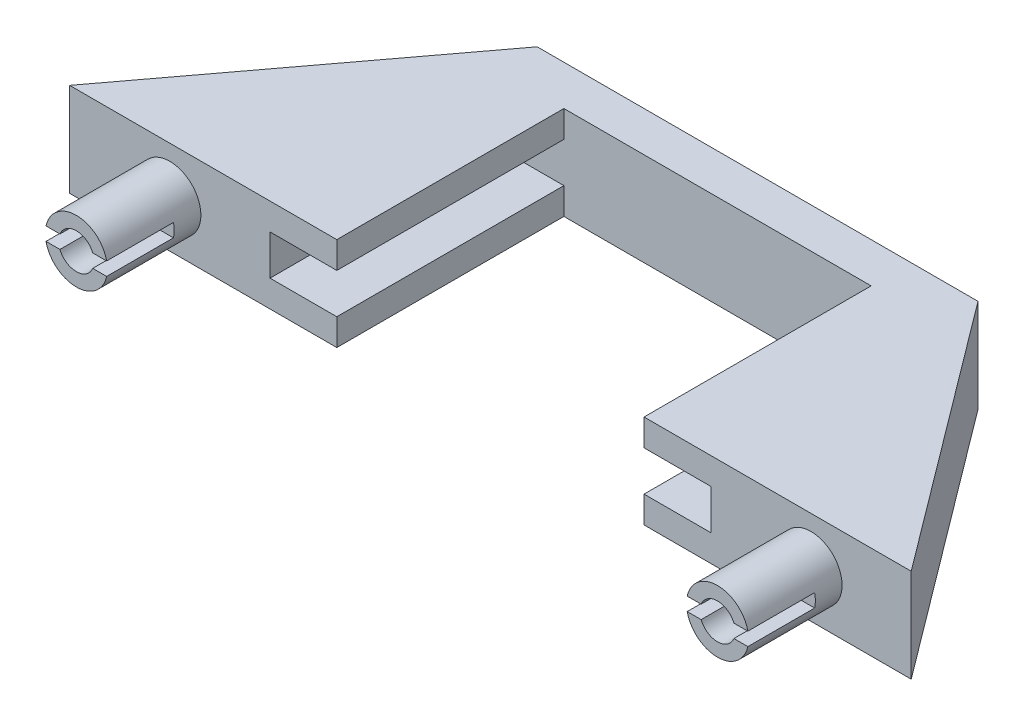
ISO-10303-21;
HEADER;
FILE_DESCRIPTION(('STEP AP214'),'2;1');
FILE_NAME('part.step','',(''),(''),'','','');
FILE_SCHEMA(('AUTOMOTIVE_DESIGN { 1 0 10303 214 1 1 1 1 }'));
ENDSEC;
DATA;
#1=APPLICATION_CONTEXT('core data for automotive mechanical design processes');
#2=APPLICATION_PROTOCOL_DEFINITION('international standard','automotive_design',2000,#1);
#3=PRODUCT_CONTEXT('',#1,'mechanical');
#4=PRODUCT('Part','Part','',(#3));
#5=PRODUCT_RELATED_PRODUCT_CATEGORY('part','',(#4));
#6=PRODUCT_DEFINITION_FORMATION('','',#4);
#7=PRODUCT_DEFINITION_CONTEXT('part definition',#1,'design');
#8=PRODUCT_DEFINITION('design','',#6,#7);
#9=PRODUCT_DEFINITION_SHAPE('','',#8);
#10=(LENGTH_UNIT() NAMED_UNIT(*) SI_UNIT(.MILLI.,.METRE.));
#11=(NAMED_UNIT(*) PLANE_ANGLE_UNIT() SI_UNIT($,.RADIAN.));
#12=(NAMED_UNIT(*) SI_UNIT($,.STERADIAN.) SOLID_ANGLE_UNIT());
#13=UNCERTAINTY_MEASURE_WITH_UNIT(LENGTH_MEASURE(1.E-05),#10,'distance_accuracy_value','');
#14=(GEOMETRIC_REPRESENTATION_CONTEXT(3) GLOBAL_UNCERTAINTY_ASSIGNED_CONTEXT((#13)) GLOBAL_UNIT_ASSIGNED_CONTEXT((#10,
#11,#12)) REPRESENTATION_CONTEXT('',''));
#15=CARTESIAN_POINT('',(0.,0.,0.));
#16=DIRECTION('',(0.,0.,1.));
#17=DIRECTION('',(1.,0.,0.));
#18=AXIS2_PLACEMENT_3D('',#15,#16,#17);
#19=CARTESIAN_POINT('',(24.,0.,27.));
#20=DIRECTION('',(0.,0.,1.));
#21=DIRECTION('',(1.,0.,0.));
#22=AXIS2_PLACEMENT_3D('',#19,#20,#21);
#23=PLANE('',#22);
#24=DIRECTION('',(-1.,0.,0.));
#25=VECTOR('',#24,1.);
#26=CARTESIAN_POINT('',(31.4065849831562,0.500000000000002,27.));
#27=LINE('',#26,#25);
#28=CARTESIAN_POINT('',(26.2706001409319,0.500000000000001,27.));
#29=VERTEX_POINT('',#28);
#30=CARTESIAN_POINT('',(25.2270391191808,0.500000000000001,27.));
#31=VERTEX_POINT('',#30);
#32=EDGE_CURVE('E458',#29,#31,#27,.T.);
#33=ORIENTED_EDGE('',*,*,#32,.F.);
#34=CARTESIAN_POINT('',(24.,0.,27.));
#35=DIRECTION('',(0.,0.,1.));
#36=DIRECTION('',(1.,0.,0.));
#37=AXIS2_PLACEMENT_3D('',#34,#35,#36);
#38=CIRCLE('',#37,2.325);
#39=CARTESIAN_POINT('',(21.7293998590681,0.500000000000001,27.));
#40=VERTEX_POINT('',#39);
#41=EDGE_CURVE('E271',#29,#40,#38,.T.);
#42=ORIENTED_EDGE('',*,*,#41,.T.);
#43=CARTESIAN_POINT('',(22.7729608808192,0.500000000000001,27.));
#44=VERTEX_POINT('',#43);
#45=EDGE_CURVE('E263',#44,#40,#27,.T.);
#46=ORIENTED_EDGE('',*,*,#45,.F.);
#47=CARTESIAN_POINT('',(24.,0.,27.));
#48=DIRECTION('',(0.,0.,1.));
#49=DIRECTION('',(1.,0.,0.));
#50=AXIS2_PLACEMENT_3D('',#47,#48,#49);
#51=CIRCLE('',#50,1.325);
#52=EDGE_CURVE('E494',#31,#44,#51,.T.);
#53=ORIENTED_EDGE('',*,*,#52,.F.);
#54=EDGE_LOOP('',(#33,#42,#46,#53));
#55=FACE_BOUND('',#54,.T.);
#56=ADVANCED_FACE('F33',(#55),#23,.T.);
#57=CARTESIAN_POINT('',(-24.,0.,27.));
#58=DIRECTION('',(0.,0.,1.));
#59=DIRECTION('',(1.,0.,0.));
#60=AXIS2_PLACEMENT_3D('',#57,#58,#59);
#61=PLANE('',#60);
#62=DIRECTION('',(1.,0.,0.));
#63=VECTOR('',#62,1.);
#64=CARTESIAN_POINT('',(-31.157432201403,-0.5,27.));
#65=LINE('',#64,#63);
#66=CARTESIAN_POINT('',(-26.2706001409319,-0.5,27.));
#67=VERTEX_POINT('',#66);
#68=CARTESIAN_POINT('',(-25.2270391191808,-0.5,27.));
#69=VERTEX_POINT('',#68);
#70=EDGE_CURVE('E443',#67,#69,#65,.T.);
#71=ORIENTED_EDGE('',*,*,#70,.F.);
#72=CARTESIAN_POINT('',(-24.,0.,27.));
#73=DIRECTION('',(0.,0.,1.));
#74=DIRECTION('',(1.,0.,0.));
#75=AXIS2_PLACEMENT_3D('',#72,#73,#74);
#76=CIRCLE('',#75,2.325);
#77=CARTESIAN_POINT('',(-21.7293998590681,-0.5,27.));
#78=VERTEX_POINT('',#77);
#79=EDGE_CURVE('E497',#67,#78,#76,.T.);
#80=ORIENTED_EDGE('',*,*,#79,.T.);
#81=CARTESIAN_POINT('',(-22.7729608808192,-0.5,27.));
#82=VERTEX_POINT('',#81);
#83=EDGE_CURVE('E446',#82,#78,#65,.T.);
#84=ORIENTED_EDGE('',*,*,#83,.F.);
#85=CARTESIAN_POINT('',(-24.,0.,27.));
#86=DIRECTION('',(0.,0.,1.));
#87=DIRECTION('',(1.,0.,0.));
#88=AXIS2_PLACEMENT_3D('',#85,#86,#87);
#89=CIRCLE('',#88,1.325);
#90=EDGE_CURVE('E490',#69,#82,#89,.T.);
#91=ORIENTED_EDGE('',*,*,#90,.F.);
#92=EDGE_LOOP('',(#71,#80,#84,#91));
#93=FACE_BOUND('',#92,.T.);
#94=ADVANCED_FACE('F593',(#93),#61,.T.);
#95=CARTESIAN_POINT('',(0.,0.,3.));
#96=DIRECTION('',(0.,0.,1.));
#97=DIRECTION('',(1.,0.,0.));
#98=AXIS2_PLACEMENT_3D('',#95,#96,#97);
#99=PLANE('',#98);
#100=DIRECTION('',(1.,0.,0.));
#101=VECTOR('',#100,1.);
#102=CARTESIAN_POINT('',(16.5,1.5,3.));
#103=LINE('',#102,#101);
#104=CARTESIAN_POINT('',(11.5,1.5,3.));
#105=VERTEX_POINT('',#104);
#106=CARTESIAN_POINT('',(16.5,1.5,3.));
#107=VERTEX_POINT('',#106);
#108=EDGE_CURVE('E308',#105,#107,#103,.T.);
#109=ORIENTED_EDGE('',*,*,#108,.F.);
#110=DIRECTION('',(0.,-1.,0.));
#111=VECTOR('',#110,1.);
#112=CARTESIAN_POINT('',(11.5,3.5,3.));
#113=LINE('',#112,#111);
#114=CARTESIAN_POINT('',(11.5,3.5,3.));
#115=VERTEX_POINT('',#114);
#116=EDGE_CURVE('E302',#115,#105,#113,.T.);
#117=ORIENTED_EDGE('',*,*,#116,.F.);
#118=DIRECTION('',(-1.,0.,0.));
#119=VECTOR('',#118,1.);
#120=CARTESIAN_POINT('',(-16.5,3.5,3.));
#121=LINE('',#120,#119);
#122=CARTESIAN_POINT('',(-11.5,3.5,3.));
#123=VERTEX_POINT('',#122);
#124=EDGE_CURVE('E390',#115,#123,#121,.T.);
#125=ORIENTED_EDGE('',*,*,#124,.T.);
#126=DIRECTION('',(0.,1.,0.));
#127=VECTOR('',#126,1.);
#128=CARTESIAN_POINT('',(-11.5,3.5,3.));
#129=LINE('',#128,#127);
#130=CARTESIAN_POINT('',(-11.5,1.5,3.));
#131=VERTEX_POINT('',#130);
#132=EDGE_CURVE('E369',#131,#123,#129,.T.);
#133=ORIENTED_EDGE('',*,*,#132,.F.);
#134=DIRECTION('',(1.,0.,0.));
#135=VECTOR('',#134,1.);
#136=CARTESIAN_POINT('',(-16.5,1.5,3.));
#137=LINE('',#136,#135);
#138=CARTESIAN_POINT('',(-16.5,1.5,3.));
#139=VERTEX_POINT('',#138);
#140=EDGE_CURVE('E365',#139,#131,#137,.T.);
#141=ORIENTED_EDGE('',*,*,#140,.F.);
#142=DIRECTION('',(0.,-1.,0.));
#143=VECTOR('',#142,1.);
#144=CARTESIAN_POINT('',(-16.5,3.5,3.));
#145=LINE('',#144,#143);
#146=CARTESIAN_POINT('',(-16.5,-1.5,3.));
#147=VERTEX_POINT('',#146);
#148=EDGE_CURVE('E393',#139,#147,#145,.T.);
#149=ORIENTED_EDGE('',*,*,#148,.T.);
#150=DIRECTION('',(-1.,0.,0.));
#151=VECTOR('',#150,1.);
#152=CARTESIAN_POINT('',(-16.5,-1.5,3.));
#153=LINE('',#152,#151);
#154=CARTESIAN_POINT('',(-11.5,-1.5,3.));
#155=VERTEX_POINT('',#154);
#156=EDGE_CURVE('E350',#155,#147,#153,.T.);
#157=ORIENTED_EDGE('',*,*,#156,.F.);
#158=DIRECTION('',(0.,1.,0.));
#159=VECTOR('',#158,1.);
#160=CARTESIAN_POINT('',(-11.5,-3.5,3.));
#161=LINE('',#160,#159);
#162=CARTESIAN_POINT('',(-11.5,-3.5,3.));
#163=VERTEX_POINT('',#162);
#164=EDGE_CURVE('E346',#163,#155,#161,.T.);
#165=ORIENTED_EDGE('',*,*,#164,.F.);
#166=DIRECTION('',(1.,0.,0.));
#167=VECTOR('',#166,1.);
#168=CARTESIAN_POINT('',(-16.5,-3.5,3.));
#169=LINE('',#168,#167);
#170=CARTESIAN_POINT('',(11.5,-3.5,3.));
#171=VERTEX_POINT('',#170);
#172=EDGE_CURVE('E396',#163,#171,#169,.T.);
#173=ORIENTED_EDGE('',*,*,#172,.T.);
#174=DIRECTION('',(0.,-1.,0.));
#175=VECTOR('',#174,1.);
#176=CARTESIAN_POINT('',(11.5,-3.5,3.));
#177=LINE('',#176,#175);
#178=CARTESIAN_POINT('',(11.5,-1.5,3.));
#179=VERTEX_POINT('',#178);
#180=EDGE_CURVE('E329',#179,#171,#177,.T.);
#181=ORIENTED_EDGE('',*,*,#180,.F.);
#182=DIRECTION('',(-1.,0.,0.));
#183=VECTOR('',#182,1.);
#184=CARTESIAN_POINT('',(16.5,-1.5,3.));
#185=LINE('',#184,#183);
#186=CARTESIAN_POINT('',(16.5,-1.5,3.));
#187=VERTEX_POINT('',#186);
#188=EDGE_CURVE('E325',#187,#179,#185,.T.);
#189=ORIENTED_EDGE('',*,*,#188,.F.);
#190=DIRECTION('',(0.,1.,0.));
#191=VECTOR('',#190,1.);
#192=CARTESIAN_POINT('',(16.5,3.5,3.));
#193=LINE('',#192,#191);
#194=EDGE_CURVE('E387',#187,#107,#193,.T.);
#195=ORIENTED_EDGE('',*,*,#194,.T.);
#196=EDGE_LOOP('',(#109,#117,#125,#133,#141,#149,#157,#165,#173,#181,#189,#195));
#197=FACE_BOUND('',#196,.T.);
#198=ADVANCED_FACE('F558',(#197),#99,.T.);
#199=CARTESIAN_POINT('',(-16.5,3.5,3.));
#200=DIRECTION('',(0.,-1.,0.));
#201=DIRECTION('',(0.,0.,-1.));
#202=AXIS2_PLACEMENT_3D('',#199,#200,#201);
#203=PLANE('',#202);
#204=DIRECTION('',(-1.,0.,0.));
#205=VECTOR('',#204,1.);
#206=CARTESIAN_POINT('',(-16.5,3.5,0.));
#207=LINE('',#206,#205);
#208=CARTESIAN_POINT('',(16.5,3.5,0.));
#209=VERTEX_POINT('',#208);
#210=CARTESIAN_POINT('',(-16.5,3.5,0.));
#211=VERTEX_POINT('',#210);
#212=EDGE_CURVE('E400',#209,#211,#207,.T.);
#213=ORIENTED_EDGE('',*,*,#212,.T.);
#214=DIRECTION('',(-0.6,0.,0.8));
#215=VECTOR('',#214,1.);
#216=CARTESIAN_POINT('',(-31.5,3.5,20.));
#217=LINE('',#216,#215);
#218=CARTESIAN_POINT('',(-31.5,3.5,20.));
#219=VERTEX_POINT('',#218);
#220=EDGE_CURVE('E291',#211,#219,#217,.T.);
#221=ORIENTED_EDGE('',*,*,#220,.T.);
#222=DIRECTION('',(-1.,0.,0.));
#223=VECTOR('',#222,1.);
#224=CARTESIAN_POINT('',(-16.5,3.5,20.));
#225=LINE('',#224,#223);
#226=CARTESIAN_POINT('',(-11.5,3.5,20.));
#227=VERTEX_POINT('',#226);
#228=EDGE_CURVE('E371',#227,#219,#225,.T.);
#229=ORIENTED_EDGE('',*,*,#228,.F.);
#230=DIRECTION('',(0.,0.,-1.));
#231=VECTOR('',#230,1.);
#232=CARTESIAN_POINT('',(-11.5,3.5,20.));
#233=LINE('',#232,#231);
#234=EDGE_CURVE('E373',#227,#123,#233,.T.);
#235=ORIENTED_EDGE('',*,*,#234,.T.);
#236=ORIENTED_EDGE('',*,*,#124,.F.);
#237=DIRECTION('',(0.,0.,-1.));
#238=VECTOR('',#237,1.);
#239=CARTESIAN_POINT('',(11.5,3.5,20.));
#240=LINE('',#239,#238);
#241=CARTESIAN_POINT('',(11.5,3.5,20.));
#242=VERTEX_POINT('',#241);
#243=EDGE_CURVE('E322',#242,#115,#240,.T.);
#244=ORIENTED_EDGE('',*,*,#243,.F.);
#245=DIRECTION('',(-1.,0.,0.));
#246=VECTOR('',#245,1.);
#247=CARTESIAN_POINT('',(16.5,3.5,20.));
#248=LINE('',#247,#246);
#249=CARTESIAN_POINT('',(31.5,3.5,20.));
#250=VERTEX_POINT('',#249);
#251=EDGE_CURVE('E305',#250,#242,#248,.T.);
#252=ORIENTED_EDGE('',*,*,#251,.F.);
#253=DIRECTION('',(-0.6,0.,-0.8));
#254=VECTOR('',#253,1.);
#255=CARTESIAN_POINT('',(31.5,3.5,20.));
#256=LINE('',#255,#254);
#257=EDGE_CURVE('E275',#250,#209,#256,.T.);
#258=ORIENTED_EDGE('',*,*,#257,.T.);
#259=EDGE_LOOP('',(#213,#221,#229,#235,#236,#244,#252,#258));
#260=FACE_BOUND('',#259,.T.);
#261=ADVANCED_FACE('F35',(#260),#203,.F.);
#262=CARTESIAN_POINT('',(-16.5,-3.5,3.));
#263=DIRECTION('',(0.,1.,0.));
#264=DIRECTION('',(0.,0.,1.));
#265=AXIS2_PLACEMENT_3D('',#262,#263,#264);
#266=PLANE('',#265);
#267=DIRECTION('',(1.,0.,0.));
#268=VECTOR('',#267,1.);
#269=CARTESIAN_POINT('',(-16.5,-3.5,0.));
#270=LINE('',#269,#268);
#271=CARTESIAN_POINT('',(-16.5,-3.5,0.));
#272=VERTEX_POINT('',#271);
#273=CARTESIAN_POINT('',(16.5,-3.5,0.));
#274=VERTEX_POINT('',#273);
#275=EDGE_CURVE('E391',#272,#274,#270,.T.);
#276=ORIENTED_EDGE('',*,*,#275,.T.);
#277=DIRECTION('',(-0.6,0.,-0.8));
#278=VECTOR('',#277,1.);
#279=CARTESIAN_POINT('',(31.5,-3.5,20.));
#280=LINE('',#279,#278);
#281=CARTESIAN_POINT('',(31.5,-3.5,20.));
#282=VERTEX_POINT('',#281);
#283=EDGE_CURVE('E283',#282,#274,#280,.T.);
#284=ORIENTED_EDGE('',*,*,#283,.F.);
#285=DIRECTION('',(1.,0.,0.));
#286=VECTOR('',#285,1.);
#287=CARTESIAN_POINT('',(16.5,-3.5,20.));
#288=LINE('',#287,#286);
#289=CARTESIAN_POINT('',(11.5,-3.5,20.));
#290=VERTEX_POINT('',#289);
#291=EDGE_CURVE('E331',#290,#282,#288,.T.);
#292=ORIENTED_EDGE('',*,*,#291,.F.);
#293=DIRECTION('',(0.,0.,-1.));
#294=VECTOR('',#293,1.);
#295=CARTESIAN_POINT('',(11.5,-3.5,20.));
#296=LINE('',#295,#294);
#297=EDGE_CURVE('E333',#290,#171,#296,.T.);
#298=ORIENTED_EDGE('',*,*,#297,.T.);
#299=ORIENTED_EDGE('',*,*,#172,.F.);
#300=DIRECTION('',(0.,0.,-1.));
#301=VECTOR('',#300,1.);
#302=CARTESIAN_POINT('',(-11.5,-3.5,20.));
#303=LINE('',#302,#301);
#304=CARTESIAN_POINT('',(-11.5,-3.5,20.));
#305=VERTEX_POINT('',#304);
#306=EDGE_CURVE('E363',#305,#163,#303,.T.);
#307=ORIENTED_EDGE('',*,*,#306,.F.);
#308=DIRECTION('',(1.,0.,0.));
#309=VECTOR('',#308,1.);
#310=CARTESIAN_POINT('',(-16.5,-3.5,20.));
#311=LINE('',#310,#309);
#312=CARTESIAN_POINT('',(-31.5,-3.5,20.));
#313=VERTEX_POINT('',#312);
#314=EDGE_CURVE('E347',#313,#305,#311,.T.);
#315=ORIENTED_EDGE('',*,*,#314,.F.);
#316=DIRECTION('',(-0.6,0.,0.8));
#317=VECTOR('',#316,1.);
#318=CARTESIAN_POINT('',(-31.5,-3.5,20.));
#319=LINE('',#318,#317);
#320=EDGE_CURVE('E293',#272,#313,#319,.T.);
#321=ORIENTED_EDGE('',*,*,#320,.F.);
#322=EDGE_LOOP('',(#276,#284,#292,#298,#299,#307,#315,#321));
#323=FACE_BOUND('',#322,.T.);
#324=ADVANCED_FACE('F533',(#323),#266,.F.);
#325=CARTESIAN_POINT('',(0.,0.,0.));
#326=DIRECTION('',(0.,0.,1.));
#327=DIRECTION('',(1.,0.,0.));
#328=AXIS2_PLACEMENT_3D('',#325,#326,#327);
#329=PLANE('',#328);
#330=DIRECTION('',(0.,1.,0.));
#331=VECTOR('',#330,1.);
#332=CARTESIAN_POINT('',(16.5,3.5,0.));
#333=LINE('',#332,#331);
#334=EDGE_CURVE('E386',#274,#209,#333,.T.);
#335=ORIENTED_EDGE('',*,*,#334,.F.);
#336=ORIENTED_EDGE('',*,*,#275,.F.);
#337=DIRECTION('',(0.,-1.,0.));
#338=VECTOR('',#337,1.);
#339=CARTESIAN_POINT('',(-16.5,3.5,0.));
#340=LINE('',#339,#338);
#341=EDGE_CURVE('E403',#211,#272,#340,.T.);
#342=ORIENTED_EDGE('',*,*,#341,.F.);
#343=ORIENTED_EDGE('',*,*,#212,.F.);
#344=EDGE_LOOP('',(#335,#336,#342,#343));
#345=FACE_BOUND('',#344,.T.);
#346=ADVANCED_FACE('F531',(#345),#329,.F.);
#347=CARTESIAN_POINT('',(-16.5,1.5,20.));
#348=DIRECTION('',(0.,1.,0.));
#349=DIRECTION('',(0.,0.,1.));
#350=AXIS2_PLACEMENT_3D('',#347,#348,#349);
#351=PLANE('',#350);
#352=ORIENTED_EDGE('',*,*,#140,.T.);
#353=DIRECTION('',(0.,0.,-1.));
#354=VECTOR('',#353,1.);
#355=CARTESIAN_POINT('',(-11.5,1.5,20.));
#356=LINE('',#355,#354);
#357=CARTESIAN_POINT('',(-11.5,1.5,20.));
#358=VERTEX_POINT('',#357);
#359=EDGE_CURVE('E380',#358,#131,#356,.T.);
#360=ORIENTED_EDGE('',*,*,#359,.F.);
#361=DIRECTION('',(1.,0.,0.));
#362=VECTOR('',#361,1.);
#363=CARTESIAN_POINT('',(-16.5,1.5,20.));
#364=LINE('',#363,#362);
#365=CARTESIAN_POINT('',(-16.5,1.5,20.));
#366=VERTEX_POINT('',#365);
#367=EDGE_CURVE('E366',#366,#358,#364,.T.);
#368=ORIENTED_EDGE('',*,*,#367,.F.);
#369=DIRECTION('',(0.,0.,-1.));
#370=VECTOR('',#369,1.);
#371=CARTESIAN_POINT('',(-16.5,1.5,20.));
#372=LINE('',#371,#370);
#373=EDGE_CURVE('E383',#366,#139,#372,.T.);
#374=ORIENTED_EDGE('',*,*,#373,.T.);
#375=EDGE_LOOP('',(#352,#360,#368,#374));
#376=FACE_BOUND('',#375,.T.);
#377=ADVANCED_FACE('F552',(#376),#351,.F.);
#378=CARTESIAN_POINT('',(-11.5,3.5,20.));
#379=DIRECTION('',(-1.,0.,0.));
#380=DIRECTION('',(0.,0.,1.));
#381=AXIS2_PLACEMENT_3D('',#378,#379,#380);
#382=PLANE('',#381);
#383=ORIENTED_EDGE('',*,*,#132,.T.);
#384=ORIENTED_EDGE('',*,*,#234,.F.);
#385=DIRECTION('',(0.,1.,0.));
#386=VECTOR('',#385,1.);
#387=CARTESIAN_POINT('',(-11.5,3.5,20.));
#388=LINE('',#387,#386);
#389=EDGE_CURVE('E368',#358,#227,#388,.T.);
#390=ORIENTED_EDGE('',*,*,#389,.F.);
#391=ORIENTED_EDGE('',*,*,#359,.T.);
#392=EDGE_LOOP('',(#383,#384,#390,#391));
#393=FACE_BOUND('',#392,.T.);
#394=ADVANCED_FACE('F515',(#393),#382,.F.);
#395=CARTESIAN_POINT('',(0.,0.,20.));
#396=DIRECTION('',(0.,0.,1.));
#397=DIRECTION('',(1.,0.,0.));
#398=AXIS2_PLACEMENT_3D('',#395,#396,#397);
#399=PLANE('',#398);
#400=CARTESIAN_POINT('',(-24.,0.,20.));
#401=DIRECTION('',(0.,0.,1.));
#402=DIRECTION('',(1.,0.,0.));
#403=AXIS2_PLACEMENT_3D('',#400,#401,#402);
#404=CIRCLE('',#403,2.325);
#405=CARTESIAN_POINT('',(-21.675,0.,20.));
#406=VERTEX_POINT('',#405);
#407=EDGE_CURVE('E280',#406,#406,#404,.T.);
#408=ORIENTED_EDGE('',*,*,#407,.F.);
#409=EDGE_LOOP('',(#408));
#410=FACE_BOUND('',#409,.T.);
#411=ORIENTED_EDGE('',*,*,#228,.T.);
#412=DIRECTION('',(0.,1.,0.));
#413=VECTOR('',#412,1.);
#414=CARTESIAN_POINT('',(-31.5,-3.5,20.));
#415=LINE('',#414,#413);
#416=EDGE_CURVE('E296',#313,#219,#415,.T.);
#417=ORIENTED_EDGE('',*,*,#416,.F.);
#418=ORIENTED_EDGE('',*,*,#314,.T.);
#419=DIRECTION('',(0.,1.,0.));
#420=VECTOR('',#419,1.);
#421=CARTESIAN_POINT('',(-11.5,-3.5,20.));
#422=LINE('',#421,#420);
#423=CARTESIAN_POINT('',(-11.5,-1.5,20.));
#424=VERTEX_POINT('',#423);
#425=EDGE_CURVE('E349',#305,#424,#422,.T.);
#426=ORIENTED_EDGE('',*,*,#425,.T.);
#427=DIRECTION('',(-1.,0.,0.));
#428=VECTOR('',#427,1.);
#429=CARTESIAN_POINT('',(-16.5,-1.5,20.));
#430=LINE('',#429,#428);
#431=CARTESIAN_POINT('',(-16.5,-1.5,20.));
#432=VERTEX_POINT('',#431);
#433=EDGE_CURVE('E352',#424,#432,#430,.T.);
#434=ORIENTED_EDGE('',*,*,#433,.T.);
#435=DIRECTION('',(0.,1.,0.));
#436=VECTOR('',#435,1.);
#437=CARTESIAN_POINT('',(-16.5,-3.5,20.));
#438=LINE('',#437,#436);
#439=EDGE_CURVE('E299',#432,#366,#438,.T.);
#440=ORIENTED_EDGE('',*,*,#439,.T.);
#441=ORIENTED_EDGE('',*,*,#367,.T.);
#442=ORIENTED_EDGE('',*,*,#389,.T.);
#443=EDGE_LOOP('',(#411,#417,#418,#426,#434,#440,#441,#442));
#444=FACE_BOUND('',#443,.T.);
#445=ADVANCED_FACE('F511',(#410,#444),#399,.T.);
#446=CARTESIAN_POINT('',(-11.5,-3.5,20.));
#447=DIRECTION('',(-1.,0.,0.));
#448=DIRECTION('',(0.,0.,1.));
#449=AXIS2_PLACEMENT_3D('',#446,#447,#448);
#450=PLANE('',#449);
#451=ORIENTED_EDGE('',*,*,#164,.T.);
#452=DIRECTION('',(0.,0.,-1.));
#453=VECTOR('',#452,1.);
#454=CARTESIAN_POINT('',(-11.5,-1.5,20.));
#455=LINE('',#454,#453);
#456=EDGE_CURVE('E361',#424,#155,#455,.T.);
#457=ORIENTED_EDGE('',*,*,#456,.F.);
#458=ORIENTED_EDGE('',*,*,#425,.F.);
#459=ORIENTED_EDGE('',*,*,#306,.T.);
#460=EDGE_LOOP('',(#451,#457,#458,#459));
#461=FACE_BOUND('',#460,.T.);
#462=ADVANCED_FACE('F514',(#461),#450,.F.);
#463=CARTESIAN_POINT('',(-16.5,-1.5,20.));
#464=DIRECTION('',(0.,-1.,0.));
#465=DIRECTION('',(0.,0.,-1.));
#466=AXIS2_PLACEMENT_3D('',#463,#464,#465);
#467=PLANE('',#466);
#468=ORIENTED_EDGE('',*,*,#156,.T.);
#469=DIRECTION('',(0.,0.,-1.));
#470=VECTOR('',#469,1.);
#471=CARTESIAN_POINT('',(-16.5,-1.5,20.));
#472=LINE('',#471,#470);
#473=EDGE_CURVE('E355',#432,#147,#472,.T.);
#474=ORIENTED_EDGE('',*,*,#473,.F.);
#475=ORIENTED_EDGE('',*,*,#433,.F.);
#476=ORIENTED_EDGE('',*,*,#456,.T.);
#477=EDGE_LOOP('',(#468,#474,#475,#476));
#478=FACE_BOUND('',#477,.T.);
#479=ADVANCED_FACE('F545',(#478),#467,.F.);
#480=CARTESIAN_POINT('',(16.5,-1.5,20.));
#481=DIRECTION('',(0.,-1.,0.));
#482=DIRECTION('',(1.,0.,0.));
#483=AXIS2_PLACEMENT_3D('',#480,#481,#482);
#484=PLANE('',#483);
#485=ORIENTED_EDGE('',*,*,#188,.T.);
#486=DIRECTION('',(0.,0.,-1.));
#487=VECTOR('',#486,1.);
#488=CARTESIAN_POINT('',(11.5,-1.5,20.));
#489=LINE('',#488,#487);
#490=CARTESIAN_POINT('',(11.5,-1.5,20.));
#491=VERTEX_POINT('',#490);
#492=EDGE_CURVE('E340',#491,#179,#489,.T.);
#493=ORIENTED_EDGE('',*,*,#492,.F.);
#494=DIRECTION('',(-1.,0.,0.));
#495=VECTOR('',#494,1.);
#496=CARTESIAN_POINT('',(16.5,-1.5,20.));
#497=LINE('',#496,#495);
#498=CARTESIAN_POINT('',(16.5,-1.5,20.));
#499=VERTEX_POINT('',#498);
#500=EDGE_CURVE('E326',#499,#491,#497,.T.);
#501=ORIENTED_EDGE('',*,*,#500,.F.);
#502=DIRECTION('',(0.,0.,-1.));
#503=VECTOR('',#502,1.);
#504=CARTESIAN_POINT('',(16.5,-1.5,20.));
#505=LINE('',#504,#503);
#506=EDGE_CURVE('E343',#499,#187,#505,.T.);
#507=ORIENTED_EDGE('',*,*,#506,.T.);
#508=EDGE_LOOP('',(#485,#493,#501,#507));
#509=FACE_BOUND('',#508,.T.);
#510=ADVANCED_FACE('F578',(#509),#484,.F.);
#511=CARTESIAN_POINT('',(11.5,-3.5,20.));
#512=DIRECTION('',(1.,0.,0.));
#513=DIRECTION('',(0.,0.,-1.));
#514=AXIS2_PLACEMENT_3D('',#511,#512,#513);
#515=PLANE('',#514);
#516=ORIENTED_EDGE('',*,*,#180,.T.);
#517=ORIENTED_EDGE('',*,*,#297,.F.);
#518=DIRECTION('',(0.,-1.,0.));
#519=VECTOR('',#518,1.);
#520=CARTESIAN_POINT('',(11.5,-3.5,20.));
#521=LINE('',#520,#519);
#522=EDGE_CURVE('E328',#491,#290,#521,.T.);
#523=ORIENTED_EDGE('',*,*,#522,.F.);
#524=ORIENTED_EDGE('',*,*,#492,.T.);
#525=EDGE_LOOP('',(#516,#517,#523,#524));
#526=FACE_BOUND('',#525,.T.);
#527=ADVANCED_FACE('F574',(#526),#515,.F.);
#528=CARTESIAN_POINT('',(0.,0.,20.));
#529=DIRECTION('',(0.,0.,1.));
#530=DIRECTION('',(1.,0.,0.));
#531=AXIS2_PLACEMENT_3D('',#528,#529,#530);
#532=PLANE('',#531);
#533=CARTESIAN_POINT('',(24.,0.,20.));
#534=DIRECTION('',(0.,0.,1.));
#535=DIRECTION('',(1.,0.,0.));
#536=AXIS2_PLACEMENT_3D('',#533,#534,#535);
#537=CIRCLE('',#536,2.325);
#538=CARTESIAN_POINT('',(26.325,0.,20.));
#539=VERTEX_POINT('',#538);
#540=EDGE_CURVE('E272',#539,#539,#537,.T.);
#541=ORIENTED_EDGE('',*,*,#540,.F.);
#542=EDGE_LOOP('',(#541));
#543=FACE_BOUND('',#542,.T.);
#544=ORIENTED_EDGE('',*,*,#291,.T.);
#545=DIRECTION('',(0.,1.,0.));
#546=VECTOR('',#545,1.);
#547=CARTESIAN_POINT('',(31.5,-3.5,20.));
#548=LINE('',#547,#546);
#549=EDGE_CURVE('E288',#282,#250,#548,.T.);
#550=ORIENTED_EDGE('',*,*,#549,.T.);
#551=ORIENTED_EDGE('',*,*,#251,.T.);
#552=DIRECTION('',(0.,-1.,0.));
#553=VECTOR('',#552,1.);
#554=CARTESIAN_POINT('',(11.5,3.5,20.));
#555=LINE('',#554,#553);
#556=CARTESIAN_POINT('',(11.5,1.5,20.));
#557=VERTEX_POINT('',#556);
#558=EDGE_CURVE('E307',#242,#557,#555,.T.);
#559=ORIENTED_EDGE('',*,*,#558,.T.);
#560=DIRECTION('',(1.,0.,0.));
#561=VECTOR('',#560,1.);
#562=CARTESIAN_POINT('',(16.5,1.5,20.));
#563=LINE('',#562,#561);
#564=CARTESIAN_POINT('',(16.5,1.5,20.));
#565=VERTEX_POINT('',#564);
#566=EDGE_CURVE('E310',#557,#565,#563,.T.);
#567=ORIENTED_EDGE('',*,*,#566,.T.);
#568=DIRECTION('',(0.,1.,0.));
#569=VECTOR('',#568,1.);
#570=CARTESIAN_POINT('',(16.5,-3.5,20.));
#571=LINE('',#570,#569);
#572=EDGE_CURVE('E285',#499,#565,#571,.T.);
#573=ORIENTED_EDGE('',*,*,#572,.F.);
#574=ORIENTED_EDGE('',*,*,#500,.T.);
#575=ORIENTED_EDGE('',*,*,#522,.T.);
#576=EDGE_LOOP('',(#544,#550,#551,#559,#567,#573,#574,#575));
#577=FACE_BOUND('',#576,.T.);
#578=ADVANCED_FACE('F564',(#543,#577),#532,.T.);
#579=CARTESIAN_POINT('',(11.5,3.5,20.));
#580=DIRECTION('',(1.,0.,0.));
#581=DIRECTION('',(0.,0.,-1.));
#582=AXIS2_PLACEMENT_3D('',#579,#580,#581);
#583=PLANE('',#582);
#584=ORIENTED_EDGE('',*,*,#116,.T.);
#585=DIRECTION('',(0.,0.,-1.));
#586=VECTOR('',#585,1.);
#587=CARTESIAN_POINT('',(11.5,1.5,20.));
#588=LINE('',#587,#586);
#589=EDGE_CURVE('E319',#557,#105,#588,.T.);
#590=ORIENTED_EDGE('',*,*,#589,.F.);
#591=ORIENTED_EDGE('',*,*,#558,.F.);
#592=ORIENTED_EDGE('',*,*,#243,.T.);
#593=EDGE_LOOP('',(#584,#590,#591,#592));
#594=FACE_BOUND('',#593,.T.);
#595=ADVANCED_FACE('F561',(#594),#583,.F.);
#596=CARTESIAN_POINT('',(16.5,1.5,20.));
#597=DIRECTION('',(0.,1.,0.));
#598=DIRECTION('',(0.,0.,1.));
#599=AXIS2_PLACEMENT_3D('',#596,#597,#598);
#600=PLANE('',#599);
#601=ORIENTED_EDGE('',*,*,#108,.T.);
#602=DIRECTION('',(0.,0.,-1.));
#603=VECTOR('',#602,1.);
#604=CARTESIAN_POINT('',(16.5,1.5,20.));
#605=LINE('',#604,#603);
#606=EDGE_CURVE('E313',#565,#107,#605,.T.);
#607=ORIENTED_EDGE('',*,*,#606,.F.);
#608=ORIENTED_EDGE('',*,*,#566,.F.);
#609=ORIENTED_EDGE('',*,*,#589,.T.);
#610=EDGE_LOOP('',(#601,#607,#608,#609));
#611=FACE_BOUND('',#610,.T.);
#612=ADVANCED_FACE('F583',(#611),#600,.F.);
#613=CARTESIAN_POINT('',(-16.5,-3.5,20.));
#614=DIRECTION('',(1.,0.,0.));
#615=DIRECTION('',(0.,0.,-1.));
#616=AXIS2_PLACEMENT_3D('',#613,#614,#615);
#617=PLANE('',#616);
#618=ORIENTED_EDGE('',*,*,#439,.F.);
#619=ORIENTED_EDGE('',*,*,#473,.T.);
#620=ORIENTED_EDGE('',*,*,#148,.F.);
#621=ORIENTED_EDGE('',*,*,#373,.F.);
#622=EDGE_LOOP('',(#618,#619,#620,#621));
#623=FACE_BOUND('',#622,.T.);
#624=ADVANCED_FACE('F547',(#623),#617,.T.);
#625=CARTESIAN_POINT('',(-31.5,-3.5,20.));
#626=DIRECTION('',(-0.8,0.,-0.6));
#627=DIRECTION('',(-0.6,0.,0.8));
#628=AXIS2_PLACEMENT_3D('',#625,#626,#627);
#629=PLANE('',#628);
#630=ORIENTED_EDGE('',*,*,#220,.F.);
#631=ORIENTED_EDGE('',*,*,#341,.T.);
#632=ORIENTED_EDGE('',*,*,#320,.T.);
#633=ORIENTED_EDGE('',*,*,#416,.T.);
#634=EDGE_LOOP('',(#630,#631,#632,#633));
#635=FACE_BOUND('',#634,.T.);
#636=ADVANCED_FACE('F523',(#635),#629,.T.);
#637=CARTESIAN_POINT('',(16.5,-3.5,20.));
#638=DIRECTION('',(-1.,0.,0.));
#639=DIRECTION('',(0.,0.,1.));
#640=AXIS2_PLACEMENT_3D('',#637,#638,#639);
#641=PLANE('',#640);
#642=ORIENTED_EDGE('',*,*,#572,.T.);
#643=ORIENTED_EDGE('',*,*,#606,.T.);
#644=ORIENTED_EDGE('',*,*,#194,.F.);
#645=ORIENTED_EDGE('',*,*,#506,.F.);
#646=EDGE_LOOP('',(#642,#643,#644,#645));
#647=FACE_BOUND('',#646,.T.);
#648=ADVANCED_FACE('F581',(#647),#641,.T.);
#649=CARTESIAN_POINT('',(31.5,-3.5,20.));
#650=DIRECTION('',(0.8,0.,-0.6));
#651=DIRECTION('',(-0.6,0.,-0.8));
#652=AXIS2_PLACEMENT_3D('',#649,#650,#651);
#653=PLANE('',#652);
#654=ORIENTED_EDGE('',*,*,#257,.F.);
#655=ORIENTED_EDGE('',*,*,#549,.F.);
#656=ORIENTED_EDGE('',*,*,#283,.T.);
#657=ORIENTED_EDGE('',*,*,#334,.T.);
#658=EDGE_LOOP('',(#654,#655,#656,#657));
#659=FACE_BOUND('',#658,.T.);
#660=ADVANCED_FACE('F570',(#659),#653,.T.);
#661=CARTESIAN_POINT('',(24.,0.,27.));
#662=DIRECTION('',(0.,0.,-1.));
#663=DIRECTION('',(-1.,0.,0.));
#664=AXIS2_PLACEMENT_3D('',#661,#662,#663);
#665=CYLINDRICAL_SURFACE('',#664,2.325);
#666=ORIENTED_EDGE('',*,*,#41,.F.);
#667=DIRECTION('',(0.,0.,-1.));
#668=VECTOR('',#667,1.);
#669=CARTESIAN_POINT('',(26.2706001409319,0.500000000000001,27.));
#670=LINE('',#669,#668);
#671=CARTESIAN_POINT('',(26.2706001409319,0.500000000000001,22.));
#672=VERTEX_POINT('',#671);
#673=EDGE_CURVE('E469',#29,#672,#670,.T.);
#674=ORIENTED_EDGE('',*,*,#673,.T.);
#675=CARTESIAN_POINT('',(24.,0.,22.));
#676=DIRECTION('',(0.,0.,-1.));
#677=DIRECTION('',(-1.,0.,0.));
#678=AXIS2_PLACEMENT_3D('',#675,#676,#677);
#679=CIRCLE('',#678,2.325);
#680=CARTESIAN_POINT('',(26.2706001409319,-0.499999999999999,22.));
#681=VERTEX_POINT('',#680);
#682=EDGE_CURVE('E465',#672,#681,#679,.T.);
#683=ORIENTED_EDGE('',*,*,#682,.T.);
#684=DIRECTION('',(0.,0.,-1.));
#685=VECTOR('',#684,1.);
#686=CARTESIAN_POINT('',(26.2706001409319,-0.499999999999999,27.));
#687=LINE('',#686,#685);
#688=CARTESIAN_POINT('',(26.2706001409319,-0.499999999999999,27.));
#689=VERTEX_POINT('',#688);
#690=EDGE_CURVE('E253',#681,#689,#687,.F.);
#691=ORIENTED_EDGE('',*,*,#690,.T.);
#692=CARTESIAN_POINT('',(21.7293998590681,-0.499999999999999,27.));
#693=VERTEX_POINT('',#692);
#694=EDGE_CURVE('E260',#693,#689,#38,.T.);
#695=ORIENTED_EDGE('',*,*,#694,.F.);
#696=DIRECTION('',(0.,0.,-1.));
#697=VECTOR('',#696,1.);
#698=CARTESIAN_POINT('',(21.7293998590681,-0.499999999999999,27.));
#699=LINE('',#698,#697);
#700=CARTESIAN_POINT('',(21.7293998590681,-0.499999999999999,22.));
#701=VERTEX_POINT('',#700);
#702=EDGE_CURVE('E242',#693,#701,#699,.T.);
#703=ORIENTED_EDGE('',*,*,#702,.T.);
#704=CARTESIAN_POINT('',(21.7293998590681,0.5,22.));
#705=VERTEX_POINT('',#704);
#706=EDGE_CURVE('E463',#701,#705,#679,.T.);
#707=ORIENTED_EDGE('',*,*,#706,.T.);
#708=DIRECTION('',(0.,0.,-1.));
#709=VECTOR('',#708,1.);
#710=CARTESIAN_POINT('',(21.7293998590681,0.5,27.));
#711=LINE('',#710,#709);
#712=EDGE_CURVE('E252',#705,#40,#711,.F.);
#713=ORIENTED_EDGE('',*,*,#712,.T.);
#714=EDGE_LOOP('',(#666,#674,#683,#691,#695,#703,#707,#713));
#715=FACE_BOUND('',#714,.T.);
#716=ORIENTED_EDGE('',*,*,#540,.T.);
#717=EDGE_LOOP('',(#716));
#718=FACE_BOUND('',#717,.T.);
#719=ADVANCED_FACE('F268',(#715,#718),#665,.T.);
#720=DIRECTION('',(1.,0.,0.));
#721=VECTOR('',#720,1.);
#722=CARTESIAN_POINT('',(31.4065849831562,-0.499999999999998,27.));
#723=LINE('',#722,#721);
#724=CARTESIAN_POINT('',(22.7729608808192,-0.499999999999999,27.));
#725=VERTEX_POINT('',#724);
#726=EDGE_CURVE('E246',#693,#725,#723,.T.);
#727=ORIENTED_EDGE('',*,*,#726,.F.);
#728=ORIENTED_EDGE('',*,*,#694,.T.);
#729=CARTESIAN_POINT('',(25.2270391191808,-0.499999999999999,27.));
#730=VERTEX_POINT('',#729);
#731=EDGE_CURVE('E264',#730,#689,#723,.T.);
#732=ORIENTED_EDGE('',*,*,#731,.F.);
#733=EDGE_CURVE('E262',#725,#730,#51,.T.);
#734=ORIENTED_EDGE('',*,*,#733,.F.);
#735=EDGE_LOOP('',(#727,#728,#732,#734));
#736=FACE_BOUND('',#735,.T.);
#737=ADVANCED_FACE('F258',(#736),#23,.T.);
#738=CARTESIAN_POINT('',(-24.,0.,27.));
#739=DIRECTION('',(0.,0.,-1.));
#740=DIRECTION('',(-1.,0.,0.));
#741=AXIS2_PLACEMENT_3D('',#738,#739,#740);
#742=CYLINDRICAL_SURFACE('',#741,2.325);
#743=ORIENTED_EDGE('',*,*,#79,.F.);
#744=DIRECTION('',(0.,0.,-1.));
#745=VECTOR('',#744,1.);
#746=CARTESIAN_POINT('',(-26.2706001409319,-0.5,27.));
#747=LINE('',#746,#745);
#748=CARTESIAN_POINT('',(-26.2706001409319,-0.5,22.));
#749=VERTEX_POINT('',#748);
#750=EDGE_CURVE('E482',#67,#749,#747,.T.);
#751=ORIENTED_EDGE('',*,*,#750,.T.);
#752=CARTESIAN_POINT('',(-24.,0.,22.));
#753=DIRECTION('',(0.,0.,1.));
#754=DIRECTION('',(1.,0.,0.));
#755=AXIS2_PLACEMENT_3D('',#752,#753,#754);
#756=CIRCLE('',#755,2.325);
#757=CARTESIAN_POINT('',(-26.2706001409319,0.5,22.));
#758=VERTEX_POINT('',#757);
#759=EDGE_CURVE('E474',#758,#749,#756,.T.);
#760=ORIENTED_EDGE('',*,*,#759,.F.);
#761=DIRECTION('',(0.,0.,-1.));
#762=VECTOR('',#761,1.);
#763=CARTESIAN_POINT('',(-26.2706001409319,0.5,27.));
#764=LINE('',#763,#762);
#765=CARTESIAN_POINT('',(-26.2706001409319,0.5,27.));
#766=VERTEX_POINT('',#765);
#767=EDGE_CURVE('E442',#758,#766,#764,.F.);
#768=ORIENTED_EDGE('',*,*,#767,.T.);
#769=CARTESIAN_POINT('',(-21.7293998590681,0.5,27.));
#770=VERTEX_POINT('',#769);
#771=EDGE_CURVE('E277',#770,#766,#76,.T.);
#772=ORIENTED_EDGE('',*,*,#771,.F.);
#773=DIRECTION('',(0.,0.,-1.));
#774=VECTOR('',#773,1.);
#775=CARTESIAN_POINT('',(-21.7293998590681,0.5,27.));
#776=LINE('',#775,#774);
#777=CARTESIAN_POINT('',(-21.7293998590681,0.5,22.));
#778=VERTEX_POINT('',#777);
#779=EDGE_CURVE('E476',#770,#778,#776,.T.);
#780=ORIENTED_EDGE('',*,*,#779,.T.);
#781=CARTESIAN_POINT('',(-21.7293998590681,-0.5,22.));
#782=VERTEX_POINT('',#781);
#783=EDGE_CURVE('E472',#782,#778,#756,.T.);
#784=ORIENTED_EDGE('',*,*,#783,.F.);
#785=DIRECTION('',(0.,0.,-1.));
#786=VECTOR('',#785,1.);
#787=CARTESIAN_POINT('',(-21.7293998590681,-0.5,27.));
#788=LINE('',#787,#786);
#789=EDGE_CURVE('E479',#782,#78,#788,.F.);
#790=ORIENTED_EDGE('',*,*,#789,.T.);
#791=EDGE_LOOP('',(#743,#751,#760,#768,#772,#780,#784,#790));
#792=FACE_BOUND('',#791,.T.);
#793=ORIENTED_EDGE('',*,*,#407,.T.);
#794=EDGE_LOOP('',(#793));
#795=FACE_BOUND('',#794,.T.);
#796=ADVANCED_FACE('F509',(#792,#795),#742,.T.);
#797=DIRECTION('',(-1.,0.,0.));
#798=VECTOR('',#797,1.);
#799=CARTESIAN_POINT('',(-31.157432201403,0.5,27.));
#800=LINE('',#799,#798);
#801=CARTESIAN_POINT('',(-22.7729608808192,0.5,27.));
#802=VERTEX_POINT('',#801);
#803=EDGE_CURVE('E452',#770,#802,#800,.T.);
#804=ORIENTED_EDGE('',*,*,#803,.F.);
#805=ORIENTED_EDGE('',*,*,#771,.T.);
#806=CARTESIAN_POINT('',(-25.2270391191808,0.5,27.));
#807=VERTEX_POINT('',#806);
#808=EDGE_CURVE('E451',#807,#766,#800,.T.);
#809=ORIENTED_EDGE('',*,*,#808,.F.);
#810=EDGE_CURVE('E488',#802,#807,#89,.T.);
#811=ORIENTED_EDGE('',*,*,#810,.F.);
#812=EDGE_LOOP('',(#804,#805,#809,#811));
#813=FACE_BOUND('',#812,.T.);
#814=ADVANCED_FACE('F600',(#813),#61,.T.);
#815=CARTESIAN_POINT('',(-24.,0.,20.));
#816=DIRECTION('',(0.,0.,1.));
#817=DIRECTION('',(1.,0.,0.));
#818=AXIS2_PLACEMENT_3D('',#815,#816,#817);
#819=CYLINDRICAL_SURFACE('',#818,1.325);
#820=CARTESIAN_POINT('',(-24.,0.,22.));
#821=DIRECTION('',(0.,0.,1.));
#822=DIRECTION('',(1.,0.,0.));
#823=AXIS2_PLACEMENT_3D('',#820,#821,#822);
#824=CIRCLE('',#823,1.325);
#825=CARTESIAN_POINT('',(-25.2270391191808,-0.5,22.));
#826=VERTEX_POINT('',#825);
#827=CARTESIAN_POINT('',(-25.2270391191808,0.5,22.));
#828=VERTEX_POINT('',#827);
#829=EDGE_CURVE('E424',#826,#828,#824,.F.);
#830=ORIENTED_EDGE('',*,*,#829,.F.);
#831=DIRECTION('',(0.,0.,1.));
#832=VECTOR('',#831,1.);
#833=CARTESIAN_POINT('',(-25.2270391191808,-0.5,20.));
#834=LINE('',#833,#832);
#835=EDGE_CURVE('E11',#826,#69,#834,.T.);
#836=ORIENTED_EDGE('',*,*,#835,.T.);
#837=ORIENTED_EDGE('',*,*,#90,.T.);
#838=DIRECTION('',(0.,0.,1.));
#839=VECTOR('',#838,1.);
#840=CARTESIAN_POINT('',(-22.7729608808192,-0.5,20.));
#841=LINE('',#840,#839);
#842=CARTESIAN_POINT('',(-22.7729608808192,-0.5,22.));
#843=VERTEX_POINT('',#842);
#844=EDGE_CURVE('E427',#82,#843,#841,.F.);
#845=ORIENTED_EDGE('',*,*,#844,.T.);
#846=CARTESIAN_POINT('',(-22.7729608808192,0.5,22.));
#847=VERTEX_POINT('',#846);
#848=EDGE_CURVE('E421',#847,#843,#824,.F.);
#849=ORIENTED_EDGE('',*,*,#848,.F.);
#850=DIRECTION('',(0.,0.,1.));
#851=VECTOR('',#850,1.);
#852=CARTESIAN_POINT('',(-22.7729608808192,0.5,20.));
#853=LINE('',#852,#851);
#854=EDGE_CURVE('E423',#847,#802,#853,.T.);
#855=ORIENTED_EDGE('',*,*,#854,.T.);
#856=ORIENTED_EDGE('',*,*,#810,.T.);
#857=DIRECTION('',(0.,0.,1.));
#858=VECTOR('',#857,1.);
#859=CARTESIAN_POINT('',(-25.2270391191808,0.5,20.));
#860=LINE('',#859,#858);
#861=EDGE_CURVE('E41',#807,#828,#860,.F.);
#862=ORIENTED_EDGE('',*,*,#861,.T.);
#863=EDGE_LOOP('',(#830,#836,#837,#845,#849,#855,#856,#862));
#864=FACE_BOUND('',#863,.T.);
#865=CARTESIAN_POINT('',(-24.,0.,20.));
#866=DIRECTION('',(0.,0.,1.));
#867=DIRECTION('',(1.,0.,0.));
#868=AXIS2_PLACEMENT_3D('',#865,#866,#867);
#869=CIRCLE('',#868,1.325);
#870=CARTESIAN_POINT('',(-22.675,0.,20.));
#871=VERTEX_POINT('',#870);
#872=EDGE_CURVE('E485',#871,#871,#869,.T.);
#873=ORIENTED_EDGE('',*,*,#872,.F.);
#874=EDGE_LOOP('',(#873));
#875=FACE_BOUND('',#874,.T.);
#876=ADVANCED_FACE('F664',(#864,#875),#819,.F.);
#877=CARTESIAN_POINT('',(-24.,0.,20.));
#878=DIRECTION('',(0.,0.,1.));
#879=DIRECTION('',(1.,0.,0.));
#880=AXIS2_PLACEMENT_3D('',#877,#878,#879);
#881=PLANE('',#880);
#882=ORIENTED_EDGE('',*,*,#872,.T.);
#883=EDGE_LOOP('',(#882));
#884=FACE_BOUND('',#883,.T.);
#885=ADVANCED_FACE('F658',(#884),#881,.T.);
#886=CARTESIAN_POINT('',(24.,0.,20.));
#887=DIRECTION('',(0.,0.,1.));
#888=DIRECTION('',(1.,0.,0.));
#889=AXIS2_PLACEMENT_3D('',#886,#887,#888);
#890=CYLINDRICAL_SURFACE('',#889,1.325);
#891=CARTESIAN_POINT('',(24.,0.,22.));
#892=DIRECTION('',(0.,0.,-1.));
#893=DIRECTION('',(-1.,0.,0.));
#894=AXIS2_PLACEMENT_3D('',#891,#892,#893);
#895=CIRCLE('',#894,1.325);
#896=CARTESIAN_POINT('',(25.2270391191808,-0.499999999999999,22.));
#897=VERTEX_POINT('',#896);
#898=CARTESIAN_POINT('',(25.2270391191808,0.500000000000001,22.));
#899=VERTEX_POINT('',#898);
#900=EDGE_CURVE('E410',#897,#899,#895,.F.);
#901=ORIENTED_EDGE('',*,*,#900,.T.);
#902=DIRECTION('',(0.,0.,1.));
#903=VECTOR('',#902,1.);
#904=CARTESIAN_POINT('',(25.2270391191808,0.500000000000001,20.));
#905=LINE('',#904,#903);
#906=EDGE_CURVE('E418',#899,#31,#905,.T.);
#907=ORIENTED_EDGE('',*,*,#906,.T.);
#908=ORIENTED_EDGE('',*,*,#52,.T.);
#909=DIRECTION('',(0.,0.,1.));
#910=VECTOR('',#909,1.);
#911=CARTESIAN_POINT('',(22.7729608808192,0.500000000000001,20.));
#912=LINE('',#911,#910);
#913=CARTESIAN_POINT('',(22.7729608808192,0.500000000000001,22.));
#914=VERTEX_POINT('',#913);
#915=EDGE_CURVE('E412',#44,#914,#912,.F.);
#916=ORIENTED_EDGE('',*,*,#915,.T.);
#917=CARTESIAN_POINT('',(22.7729608808192,-0.499999999999999,22.));
#918=VERTEX_POINT('',#917);
#919=EDGE_CURVE('E398',#914,#918,#895,.F.);
#920=ORIENTED_EDGE('',*,*,#919,.T.);
#921=DIRECTION('',(0.,0.,1.));
#922=VECTOR('',#921,1.);
#923=CARTESIAN_POINT('',(22.7729608808192,-0.499999999999999,20.));
#924=LINE('',#923,#922);
#925=EDGE_CURVE('E409',#918,#725,#924,.T.);
#926=ORIENTED_EDGE('',*,*,#925,.T.);
#927=ORIENTED_EDGE('',*,*,#733,.T.);
#928=DIRECTION('',(0.,0.,1.));
#929=VECTOR('',#928,1.);
#930=CARTESIAN_POINT('',(25.2270391191808,-0.499999999999999,20.));
#931=LINE('',#930,#929);
#932=EDGE_CURVE('E415',#730,#897,#931,.F.);
#933=ORIENTED_EDGE('',*,*,#932,.T.);
#934=EDGE_LOOP('',(#901,#907,#908,#916,#920,#926,#927,#933));
#935=FACE_BOUND('',#934,.T.);
#936=CARTESIAN_POINT('',(24.,0.,20.));
#937=DIRECTION('',(0.,0.,1.));
#938=DIRECTION('',(1.,0.,0.));
#939=AXIS2_PLACEMENT_3D('',#936,#937,#938);
#940=CIRCLE('',#939,1.325);
#941=CARTESIAN_POINT('',(25.325,0.,20.));
#942=VERTEX_POINT('',#941);
#943=EDGE_CURVE('E491',#942,#942,#940,.T.);
#944=ORIENTED_EDGE('',*,*,#943,.F.);
#945=EDGE_LOOP('',(#944));
#946=FACE_BOUND('',#945,.T.);
#947=ADVANCED_FACE('F663',(#935,#946),#890,.F.);
#948=CARTESIAN_POINT('',(24.,0.,20.));
#949=DIRECTION('',(0.,0.,1.));
#950=DIRECTION('',(1.,0.,0.));
#951=AXIS2_PLACEMENT_3D('',#948,#949,#950);
#952=PLANE('',#951);
#953=ORIENTED_EDGE('',*,*,#943,.T.);
#954=EDGE_LOOP('',(#953));
#955=FACE_BOUND('',#954,.T.);
#956=ADVANCED_FACE('F674',(#955),#952,.T.);
#957=CARTESIAN_POINT('',(0.,0.,22.));
#958=DIRECTION('',(0.,0.,-1.));
#959=DIRECTION('',(-1.,0.,0.));
#960=AXIS2_PLACEMENT_3D('',#957,#958,#959);
#961=PLANE('',#960);
#962=DIRECTION('',(1.,0.,0.));
#963=VECTOR('',#962,1.);
#964=CARTESIAN_POINT('',(31.4065849831562,-0.499999999999998,22.));
#965=LINE('',#964,#963);
#966=EDGE_CURVE('E248',#701,#918,#965,.T.);
#967=ORIENTED_EDGE('',*,*,#966,.T.);
#968=ORIENTED_EDGE('',*,*,#919,.F.);
#969=DIRECTION('',(-1.,0.,0.));
#970=VECTOR('',#969,1.);
#971=CARTESIAN_POINT('',(31.4065849831562,0.500000000000002,22.));
#972=LINE('',#971,#970);
#973=EDGE_CURVE('E459',#914,#705,#972,.T.);
#974=ORIENTED_EDGE('',*,*,#973,.T.);
#975=ORIENTED_EDGE('',*,*,#706,.F.);
#976=EDGE_LOOP('',(#967,#968,#974,#975));
#977=FACE_BOUND('',#976,.T.);
#978=ADVANCED_FACE('F678',(#977),#961,.F.);
#979=CARTESIAN_POINT('',(31.4065849831562,-0.499999999999998,22.));
#980=DIRECTION('',(0.,-1.,0.));
#981=DIRECTION('',(1.,0.,0.));
#982=AXIS2_PLACEMENT_3D('',#979,#980,#981);
#983=PLANE('',#982);
#984=ORIENTED_EDGE('',*,*,#726,.T.);
#985=ORIENTED_EDGE('',*,*,#925,.F.);
#986=ORIENTED_EDGE('',*,*,#966,.F.);
#987=ORIENTED_EDGE('',*,*,#702,.F.);
#988=EDGE_LOOP('',(#984,#985,#986,#987));
#989=FACE_BOUND('',#988,.T.);
#990=ADVANCED_FACE('F244',(#989),#983,.F.);
#991=CARTESIAN_POINT('',(31.4065849831562,0.500000000000002,22.));
#992=DIRECTION('',(0.,1.,0.));
#993=DIRECTION('',(-1.,0.,0.));
#994=AXIS2_PLACEMENT_3D('',#991,#992,#993);
#995=PLANE('',#994);
#996=ORIENTED_EDGE('',*,*,#973,.F.);
#997=ORIENTED_EDGE('',*,*,#915,.F.);
#998=ORIENTED_EDGE('',*,*,#45,.T.);
#999=ORIENTED_EDGE('',*,*,#712,.F.);
#1000=EDGE_LOOP('',(#996,#997,#998,#999));
#1001=FACE_BOUND('',#1000,.T.);
#1002=ADVANCED_FACE('F743',(#1001),#995,.F.);
#1003=ORIENTED_EDGE('',*,*,#32,.T.);
#1004=ORIENTED_EDGE('',*,*,#906,.F.);
#1005=EDGE_CURVE('E453',#672,#899,#972,.T.);
#1006=ORIENTED_EDGE('',*,*,#1005,.F.);
#1007=ORIENTED_EDGE('',*,*,#673,.F.);
#1008=EDGE_LOOP('',(#1003,#1004,#1006,#1007));
#1009=FACE_BOUND('',#1008,.T.);
#1010=ADVANCED_FACE('F753',(#1009),#995,.F.);
#1011=EDGE_CURVE('E455',#897,#681,#965,.T.);
#1012=ORIENTED_EDGE('',*,*,#1011,.F.);
#1013=ORIENTED_EDGE('',*,*,#932,.F.);
#1014=ORIENTED_EDGE('',*,*,#731,.T.);
#1015=ORIENTED_EDGE('',*,*,#690,.F.);
#1016=EDGE_LOOP('',(#1012,#1013,#1014,#1015));
#1017=FACE_BOUND('',#1016,.T.);
#1018=ADVANCED_FACE('F745',(#1017),#983,.F.);
#1019=ORIENTED_EDGE('',*,*,#1005,.T.);
#1020=ORIENTED_EDGE('',*,*,#900,.F.);
#1021=ORIENTED_EDGE('',*,*,#1011,.T.);
#1022=ORIENTED_EDGE('',*,*,#682,.F.);
#1023=EDGE_LOOP('',(#1019,#1020,#1021,#1022));
#1024=FACE_BOUND('',#1023,.T.);
#1025=ADVANCED_FACE('F735',(#1024),#961,.F.);
#1026=CARTESIAN_POINT('',(0.,0.,22.));
#1027=DIRECTION('',(0.,0.,1.));
#1028=DIRECTION('',(1.,0.,0.));
#1029=AXIS2_PLACEMENT_3D('',#1026,#1027,#1028);
#1030=PLANE('',#1029);
#1031=ORIENTED_EDGE('',*,*,#783,.T.);
#1032=DIRECTION('',(-1.,0.,0.));
#1033=VECTOR('',#1032,1.);
#1034=CARTESIAN_POINT('',(-31.157432201403,0.5,22.));
#1035=LINE('',#1034,#1033);
#1036=EDGE_CURVE('E56',#778,#847,#1035,.T.);
#1037=ORIENTED_EDGE('',*,*,#1036,.T.);
#1038=ORIENTED_EDGE('',*,*,#848,.T.);
#1039=DIRECTION('',(1.,0.,0.));
#1040=VECTOR('',#1039,1.);
#1041=CARTESIAN_POINT('',(-31.157432201403,-0.5,22.));
#1042=LINE('',#1041,#1040);
#1043=EDGE_CURVE('E445',#843,#782,#1042,.T.);
#1044=ORIENTED_EDGE('',*,*,#1043,.T.);
#1045=EDGE_LOOP('',(#1031,#1037,#1038,#1044));
#1046=FACE_BOUND('',#1045,.T.);
#1047=ADVANCED_FACE('F779',(#1046),#1030,.T.);
#1048=CARTESIAN_POINT('',(-31.157432201403,0.5,22.));
#1049=DIRECTION('',(0.,1.,0.));
#1050=DIRECTION('',(0.,0.,1.));
#1051=AXIS2_PLACEMENT_3D('',#1048,#1049,#1050);
#1052=PLANE('',#1051);
#1053=ORIENTED_EDGE('',*,*,#803,.T.);
#1054=ORIENTED_EDGE('',*,*,#854,.F.);
#1055=ORIENTED_EDGE('',*,*,#1036,.F.);
#1056=ORIENTED_EDGE('',*,*,#779,.F.);
#1057=EDGE_LOOP('',(#1053,#1054,#1055,#1056));
#1058=FACE_BOUND('',#1057,.T.);
#1059=ADVANCED_FACE('F788',(#1058),#1052,.F.);
#1060=CARTESIAN_POINT('',(-31.157432201403,-0.5,22.));
#1061=DIRECTION('',(0.,-1.,0.));
#1062=DIRECTION('',(0.,0.,-1.));
#1063=AXIS2_PLACEMENT_3D('',#1060,#1061,#1062);
#1064=PLANE('',#1063);
#1065=ORIENTED_EDGE('',*,*,#1043,.F.);
#1066=ORIENTED_EDGE('',*,*,#844,.F.);
#1067=ORIENTED_EDGE('',*,*,#83,.T.);
#1068=ORIENTED_EDGE('',*,*,#789,.F.);
#1069=EDGE_LOOP('',(#1065,#1066,#1067,#1068));
#1070=FACE_BOUND('',#1069,.T.);
#1071=ADVANCED_FACE('F797',(#1070),#1064,.F.);
#1072=ORIENTED_EDGE('',*,*,#70,.T.);
#1073=ORIENTED_EDGE('',*,*,#835,.F.);
#1074=EDGE_CURVE('E48',#749,#826,#1042,.T.);
#1075=ORIENTED_EDGE('',*,*,#1074,.F.);
#1076=ORIENTED_EDGE('',*,*,#750,.F.);
#1077=EDGE_LOOP('',(#1072,#1073,#1075,#1076));
#1078=FACE_BOUND('',#1077,.T.);
#1079=ADVANCED_FACE('F807',(#1078),#1064,.F.);
#1080=EDGE_CURVE('E436',#828,#758,#1035,.T.);
#1081=ORIENTED_EDGE('',*,*,#1080,.F.);
#1082=ORIENTED_EDGE('',*,*,#861,.F.);
#1083=ORIENTED_EDGE('',*,*,#808,.T.);
#1084=ORIENTED_EDGE('',*,*,#767,.F.);
#1085=EDGE_LOOP('',(#1081,#1082,#1083,#1084));
#1086=FACE_BOUND('',#1085,.T.);
#1087=ADVANCED_FACE('F439',(#1086),#1052,.F.);
#1088=ORIENTED_EDGE('',*,*,#759,.T.);
#1089=ORIENTED_EDGE('',*,*,#1074,.T.);
#1090=ORIENTED_EDGE('',*,*,#829,.T.);
#1091=ORIENTED_EDGE('',*,*,#1080,.T.);
#1092=EDGE_LOOP('',(#1088,#1089,#1090,#1091));
#1093=FACE_BOUND('',#1092,.T.);
#1094=ADVANCED_FACE('F435',(#1093),#1030,.T.);
#1095=CLOSED_SHELL('',(#56,#94,#198,#261,#324,#346,#377,#394,#445,#462,#479,#510,#527,#578,#595,
#612,#624,#636,#648,#660,#719,#737,#796,#814,#876,#885,#947,#956,#978,#990,#1002,#1010,#1018,
#1025,#1047,#1059,#1071,#1079,#1087,#1094));
#1096=MANIFOLD_SOLID_BREP('B2',#1095);
#1097=ADVANCED_BREP_SHAPE_REPRESENTATION('',(#18,#1096),#14);
#1098=SHAPE_DEFINITION_REPRESENTATION(#9,#1097);
ENDSEC;
END-ISO-10303-21;
